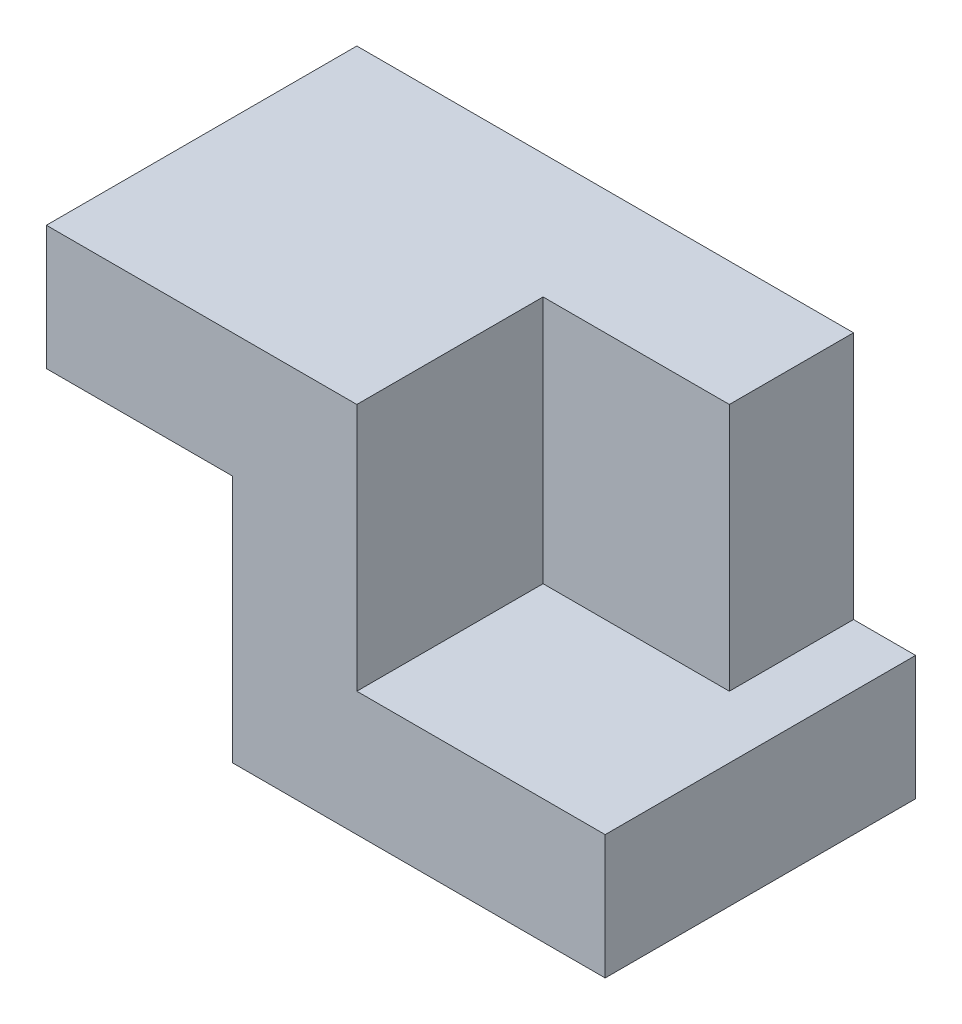
ISO-10303-21;
HEADER;
FILE_DESCRIPTION(('STEP AP214'),'2;1');
FILE_NAME('part.step','',(''),(''),'','','');
FILE_SCHEMA(('AUTOMOTIVE_DESIGN { 1 0 10303 214 1 1 1 1 }'));
ENDSEC;
DATA;
#1=APPLICATION_CONTEXT('core data for automotive mechanical design processes');
#2=APPLICATION_PROTOCOL_DEFINITION('international standard','automotive_design',2000,#1);
#3=PRODUCT_CONTEXT('',#1,'mechanical');
#4=PRODUCT('Part','Part','',(#3));
#5=PRODUCT_RELATED_PRODUCT_CATEGORY('part','',(#4));
#6=PRODUCT_DEFINITION_FORMATION('','',#4);
#7=PRODUCT_DEFINITION_CONTEXT('part definition',#1,'design');
#8=PRODUCT_DEFINITION('design','',#6,#7);
#9=PRODUCT_DEFINITION_SHAPE('','',#8);
#10=(LENGTH_UNIT() NAMED_UNIT(*) SI_UNIT(.MILLI.,.METRE.));
#11=(NAMED_UNIT(*) PLANE_ANGLE_UNIT() SI_UNIT($,.RADIAN.));
#12=(NAMED_UNIT(*) SI_UNIT($,.STERADIAN.) SOLID_ANGLE_UNIT());
#13=UNCERTAINTY_MEASURE_WITH_UNIT(LENGTH_MEASURE(1.E-05),#10,'distance_accuracy_value','');
#14=(GEOMETRIC_REPRESENTATION_CONTEXT(3) GLOBAL_UNCERTAINTY_ASSIGNED_CONTEXT((#13)) GLOBAL_UNIT_ASSIGNED_CONTEXT((#10,
#11,#12)) REPRESENTATION_CONTEXT('',''));
#15=CARTESIAN_POINT('',(0.,0.,0.));
#16=DIRECTION('',(0.,0.,1.));
#17=DIRECTION('',(1.,0.,0.));
#18=AXIS2_PLACEMENT_3D('',#15,#16,#17);
#19=CARTESIAN_POINT('',(45.,-30.,50.));
#20=DIRECTION('',(-1.,0.,0.));
#21=DIRECTION('',(0.,0.,1.));
#22=AXIS2_PLACEMENT_3D('',#19,#20,#21);
#23=PLANE('',#22);
#24=DIRECTION('',(0.,0.,-1.));
#25=VECTOR('',#24,1.);
#26=CARTESIAN_POINT('',(45.,-10.,0.));
#27=LINE('',#26,#25);
#28=CARTESIAN_POINT('',(45.,-10.,50.));
#29=VERTEX_POINT('',#28);
#30=CARTESIAN_POINT('',(45.,-10.,0.));
#31=VERTEX_POINT('',#30);
#32=EDGE_CURVE('E54',#29,#31,#27,.T.);
#33=ORIENTED_EDGE('',*,*,#32,.F.);
#34=DIRECTION('',(0.,1.,0.));
#35=VECTOR('',#34,1.);
#36=CARTESIAN_POINT('',(45.,-30.,50.));
#37=LINE('',#36,#35);
#38=CARTESIAN_POINT('',(45.,-30.,50.));
#39=VERTEX_POINT('',#38);
#40=EDGE_CURVE('E141',#39,#29,#37,.T.);
#41=ORIENTED_EDGE('',*,*,#40,.F.);
#42=DIRECTION('',(0.,0.,-1.));
#43=VECTOR('',#42,1.);
#44=CARTESIAN_POINT('',(45.,-30.,50.));
#45=LINE('',#44,#43);
#46=CARTESIAN_POINT('',(45.,-30.,0.));
#47=VERTEX_POINT('',#46);
#48=EDGE_CURVE('E47',#39,#47,#45,.T.);
#49=ORIENTED_EDGE('',*,*,#48,.T.);
#50=DIRECTION('',(0.,1.,0.));
#51=VECTOR('',#50,1.);
#52=CARTESIAN_POINT('',(45.,-30.,0.));
#53=LINE('',#52,#51);
#54=EDGE_CURVE('E191',#47,#31,#53,.T.);
#55=ORIENTED_EDGE('',*,*,#54,.T.);
#56=EDGE_LOOP('',(#33,#41,#49,#55));
#57=FACE_BOUND('',#56,.T.);
#58=ADVANCED_FACE('F39',(#57),#23,.F.);
#59=CARTESIAN_POINT('',(-45.,30.,50.));
#60=DIRECTION('',(0.,-1.,0.));
#61=DIRECTION('',(0.,0.,-1.));
#62=AXIS2_PLACEMENT_3D('',#59,#60,#61);
#63=PLANE('',#62);
#64=DIRECTION('',(0.,0.,-1.));
#65=VECTOR('',#64,1.);
#66=CARTESIAN_POINT('',(5.00000000000001,30.,0.));
#67=LINE('',#66,#65);
#68=CARTESIAN_POINT('',(5.00000000000001,30.,50.));
#69=VERTEX_POINT('',#68);
#70=CARTESIAN_POINT('',(5.00000000000001,30.,20.));
#71=VERTEX_POINT('',#70);
#72=EDGE_CURVE('E122',#69,#71,#67,.T.);
#73=ORIENTED_EDGE('',*,*,#72,.T.);
#74=DIRECTION('',(-1.,0.,0.));
#75=VECTOR('',#74,1.);
#76=CARTESIAN_POINT('',(0.,30.,20.));
#77=LINE('',#76,#75);
#78=CARTESIAN_POINT('',(35.,30.,20.));
#79=VERTEX_POINT('',#78);
#80=EDGE_CURVE('E136',#79,#71,#77,.T.);
#81=ORIENTED_EDGE('',*,*,#80,.F.);
#82=DIRECTION('',(0.,0.,1.));
#83=VECTOR('',#82,1.);
#84=CARTESIAN_POINT('',(35.,30.,0.));
#85=LINE('',#84,#83);
#86=CARTESIAN_POINT('',(35.,30.,0.));
#87=VERTEX_POINT('',#86);
#88=EDGE_CURVE('E157',#87,#79,#85,.T.);
#89=ORIENTED_EDGE('',*,*,#88,.F.);
#90=DIRECTION('',(-1.,0.,0.));
#91=VECTOR('',#90,1.);
#92=CARTESIAN_POINT('',(-45.,30.,0.));
#93=LINE('',#92,#91);
#94=CARTESIAN_POINT('',(-45.,30.,0.));
#95=VERTEX_POINT('',#94);
#96=EDGE_CURVE('E210',#87,#95,#93,.T.);
#97=ORIENTED_EDGE('',*,*,#96,.T.);
#98=DIRECTION('',(0.,0.,-1.));
#99=VECTOR('',#98,1.);
#100=CARTESIAN_POINT('',(-45.,30.,50.));
#101=LINE('',#100,#99);
#102=CARTESIAN_POINT('',(-45.,30.,50.));
#103=VERTEX_POINT('',#102);
#104=EDGE_CURVE('E11',#103,#95,#101,.T.);
#105=ORIENTED_EDGE('',*,*,#104,.F.);
#106=DIRECTION('',(-1.,0.,0.));
#107=VECTOR('',#106,1.);
#108=CARTESIAN_POINT('',(-45.,30.,50.));
#109=LINE('',#108,#107);
#110=EDGE_CURVE('E196',#69,#103,#109,.T.);
#111=ORIENTED_EDGE('',*,*,#110,.F.);
#112=EDGE_LOOP('',(#73,#81,#89,#97,#105,#111));
#113=FACE_BOUND('',#112,.T.);
#114=ADVANCED_FACE('F237',(#113),#63,.F.);
#115=CARTESIAN_POINT('',(0.,0.,50.));
#116=DIRECTION('',(0.,0.,-1.));
#117=DIRECTION('',(-1.,0.,0.));
#118=AXIS2_PLACEMENT_3D('',#115,#116,#117);
#119=PLANE('',#118);
#120=DIRECTION('',(0.,1.,0.));
#121=VECTOR('',#120,1.);
#122=CARTESIAN_POINT('',(5.00000000000001,-10.,50.));
#123=LINE('',#122,#121);
#124=CARTESIAN_POINT('',(5.00000000000001,-10.,50.));
#125=VERTEX_POINT('',#124);
#126=EDGE_CURVE('E116',#125,#69,#123,.T.);
#127=ORIENTED_EDGE('',*,*,#126,.T.);
#128=ORIENTED_EDGE('',*,*,#110,.T.);
#129=DIRECTION('',(0.,-1.,0.));
#130=VECTOR('',#129,1.);
#131=CARTESIAN_POINT('',(-45.,-30.,50.));
#132=LINE('',#131,#130);
#133=CARTESIAN_POINT('',(-45.,10.,50.));
#134=VERTEX_POINT('',#133);
#135=EDGE_CURVE('E200',#103,#134,#132,.T.);
#136=ORIENTED_EDGE('',*,*,#135,.T.);
#137=DIRECTION('',(-1.,0.,0.));
#138=VECTOR('',#137,1.);
#139=CARTESIAN_POINT('',(-15.,10.,50.));
#140=LINE('',#139,#138);
#141=CARTESIAN_POINT('',(-15.,10.,50.));
#142=VERTEX_POINT('',#141);
#143=EDGE_CURVE('E184',#142,#134,#140,.T.);
#144=ORIENTED_EDGE('',*,*,#143,.F.);
#145=DIRECTION('',(0.,1.,0.));
#146=VECTOR('',#145,1.);
#147=CARTESIAN_POINT('',(-15.,-30.,50.));
#148=LINE('',#147,#146);
#149=CARTESIAN_POINT('',(-15.,-30.,50.));
#150=VERTEX_POINT('',#149);
#151=EDGE_CURVE('E179',#150,#142,#148,.T.);
#152=ORIENTED_EDGE('',*,*,#151,.F.);
#153=DIRECTION('',(1.,0.,0.));
#154=VECTOR('',#153,1.);
#155=CARTESIAN_POINT('',(-45.,-30.,50.));
#156=LINE('',#155,#154);
#157=EDGE_CURVE('E204',#150,#39,#156,.T.);
#158=ORIENTED_EDGE('',*,*,#157,.T.);
#159=ORIENTED_EDGE('',*,*,#40,.T.);
#160=DIRECTION('',(1.,0.,0.));
#161=VECTOR('',#160,1.);
#162=CARTESIAN_POINT('',(0.,-10.,50.));
#163=LINE('',#162,#161);
#164=EDGE_CURVE('E132',#125,#29,#163,.T.);
#165=ORIENTED_EDGE('',*,*,#164,.F.);
#166=EDGE_LOOP('',(#127,#128,#136,#144,#152,#158,#159,#165));
#167=FACE_BOUND('',#166,.T.);
#168=ADVANCED_FACE('F139',(#167),#119,.F.);
#169=CARTESIAN_POINT('',(-45.,-30.,50.));
#170=DIRECTION('',(1.,0.,0.));
#171=DIRECTION('',(0.,0.,-1.));
#172=AXIS2_PLACEMENT_3D('',#169,#170,#171);
#173=PLANE('',#172);
#174=DIRECTION('',(0.,-1.,0.));
#175=VECTOR('',#174,1.);
#176=CARTESIAN_POINT('',(-45.,-30.,0.));
#177=LINE('',#176,#175);
#178=CARTESIAN_POINT('',(-45.,10.,0.));
#179=VERTEX_POINT('',#178);
#180=EDGE_CURVE('E213',#95,#179,#177,.T.);
#181=ORIENTED_EDGE('',*,*,#180,.T.);
#182=DIRECTION('',(0.,0.,-1.));
#183=VECTOR('',#182,1.);
#184=CARTESIAN_POINT('',(-45.,10.,0.));
#185=LINE('',#184,#183);
#186=EDGE_CURVE('E167',#134,#179,#185,.T.);
#187=ORIENTED_EDGE('',*,*,#186,.F.);
#188=ORIENTED_EDGE('',*,*,#135,.F.);
#189=ORIENTED_EDGE('',*,*,#104,.T.);
#190=EDGE_LOOP('',(#181,#187,#188,#189));
#191=FACE_BOUND('',#190,.T.);
#192=ADVANCED_FACE('F244',(#191),#173,.F.);
#193=CARTESIAN_POINT('',(-45.,-30.,50.));
#194=DIRECTION('',(0.,1.,0.));
#195=DIRECTION('',(0.,0.,1.));
#196=AXIS2_PLACEMENT_3D('',#193,#194,#195);
#197=PLANE('',#196);
#198=ORIENTED_EDGE('',*,*,#157,.F.);
#199=DIRECTION('',(0.,0.,1.));
#200=VECTOR('',#199,1.);
#201=CARTESIAN_POINT('',(-15.,-30.,0.));
#202=LINE('',#201,#200);
#203=CARTESIAN_POINT('',(-15.,-30.,0.));
#204=VERTEX_POINT('',#203);
#205=EDGE_CURVE('E176',#204,#150,#202,.T.);
#206=ORIENTED_EDGE('',*,*,#205,.F.);
#207=DIRECTION('',(1.,0.,0.));
#208=VECTOR('',#207,1.);
#209=CARTESIAN_POINT('',(-45.,-30.,0.));
#210=LINE('',#209,#208);
#211=EDGE_CURVE('E197',#204,#47,#210,.T.);
#212=ORIENTED_EDGE('',*,*,#211,.T.);
#213=ORIENTED_EDGE('',*,*,#48,.F.);
#214=EDGE_LOOP('',(#198,#206,#212,#213));
#215=FACE_BOUND('',#214,.T.);
#216=ADVANCED_FACE('F250',(#215),#197,.F.);
#217=CARTESIAN_POINT('',(0.,0.,0.));
#218=DIRECTION('',(0.,0.,-1.));
#219=DIRECTION('',(-1.,0.,0.));
#220=AXIS2_PLACEMENT_3D('',#217,#218,#219);
#221=PLANE('',#220);
#222=DIRECTION('',(0.,1.,0.));
#223=VECTOR('',#222,1.);
#224=CARTESIAN_POINT('',(35.,-10.,0.));
#225=LINE('',#224,#223);
#226=CARTESIAN_POINT('',(35.,-10.,0.));
#227=VERTEX_POINT('',#226);
#228=EDGE_CURVE('E127',#227,#87,#225,.T.);
#229=ORIENTED_EDGE('',*,*,#228,.F.);
#230=DIRECTION('',(-1.,0.,0.));
#231=VECTOR('',#230,1.);
#232=CARTESIAN_POINT('',(0.,-10.,0.));
#233=LINE('',#232,#231);
#234=EDGE_CURVE('E145',#31,#227,#233,.T.);
#235=ORIENTED_EDGE('',*,*,#234,.F.);
#236=ORIENTED_EDGE('',*,*,#54,.F.);
#237=ORIENTED_EDGE('',*,*,#211,.F.);
#238=DIRECTION('',(0.,-1.,0.));
#239=VECTOR('',#238,1.);
#240=CARTESIAN_POINT('',(-15.,-30.,0.));
#241=LINE('',#240,#239);
#242=CARTESIAN_POINT('',(-15.,10.,0.));
#243=VERTEX_POINT('',#242);
#244=EDGE_CURVE('E173',#243,#204,#241,.T.);
#245=ORIENTED_EDGE('',*,*,#244,.F.);
#246=DIRECTION('',(-1.,0.,0.));
#247=VECTOR('',#246,1.);
#248=CARTESIAN_POINT('',(-15.,10.,0.));
#249=LINE('',#248,#247);
#250=EDGE_CURVE('E187',#243,#179,#249,.T.);
#251=ORIENTED_EDGE('',*,*,#250,.T.);
#252=ORIENTED_EDGE('',*,*,#180,.F.);
#253=ORIENTED_EDGE('',*,*,#96,.F.);
#254=EDGE_LOOP('',(#229,#235,#236,#237,#245,#251,#252,#253));
#255=FACE_BOUND('',#254,.T.);
#256=ADVANCED_FACE('F228',(#255),#221,.T.);
#257=CARTESIAN_POINT('',(-15.,10.,0.));
#258=DIRECTION('',(0.,1.,0.));
#259=DIRECTION('',(0.,0.,1.));
#260=AXIS2_PLACEMENT_3D('',#257,#258,#259);
#261=PLANE('',#260);
#262=ORIENTED_EDGE('',*,*,#186,.T.);
#263=ORIENTED_EDGE('',*,*,#250,.F.);
#264=DIRECTION('',(0.,0.,-1.));
#265=VECTOR('',#264,1.);
#266=CARTESIAN_POINT('',(-15.,10.,0.));
#267=LINE('',#266,#265);
#268=EDGE_CURVE('E62',#142,#243,#267,.T.);
#269=ORIENTED_EDGE('',*,*,#268,.F.);
#270=ORIENTED_EDGE('',*,*,#143,.T.);
#271=EDGE_LOOP('',(#262,#263,#269,#270));
#272=FACE_BOUND('',#271,.T.);
#273=ADVANCED_FACE('F247',(#272),#261,.F.);
#274=CARTESIAN_POINT('',(-15.,0.,0.));
#275=DIRECTION('',(1.,0.,0.));
#276=DIRECTION('',(0.,0.,-1.));
#277=AXIS2_PLACEMENT_3D('',#274,#275,#276);
#278=PLANE('',#277);
#279=ORIENTED_EDGE('',*,*,#244,.T.);
#280=ORIENTED_EDGE('',*,*,#205,.T.);
#281=ORIENTED_EDGE('',*,*,#151,.T.);
#282=ORIENTED_EDGE('',*,*,#268,.T.);
#283=EDGE_LOOP('',(#279,#280,#281,#282));
#284=FACE_BOUND('',#283,.T.);
#285=ADVANCED_FACE('F249',(#284),#278,.F.);
#286=CARTESIAN_POINT('',(5.00000000000001,-10.,0.));
#287=DIRECTION('',(1.,0.,0.));
#288=DIRECTION('',(0.,0.,-1.));
#289=AXIS2_PLACEMENT_3D('',#286,#287,#288);
#290=PLANE('',#289);
#291=ORIENTED_EDGE('',*,*,#72,.F.);
#292=ORIENTED_EDGE('',*,*,#126,.F.);
#293=DIRECTION('',(0.,0.,-1.));
#294=VECTOR('',#293,1.);
#295=CARTESIAN_POINT('',(5.00000000000001,-10.,0.));
#296=LINE('',#295,#294);
#297=CARTESIAN_POINT('',(5.00000000000001,-10.,20.));
#298=VERTEX_POINT('',#297);
#299=EDGE_CURVE('E119',#125,#298,#296,.T.);
#300=ORIENTED_EDGE('',*,*,#299,.T.);
#301=DIRECTION('',(0.,1.,0.));
#302=VECTOR('',#301,1.);
#303=CARTESIAN_POINT('',(5.00000000000001,-10.,20.));
#304=LINE('',#303,#302);
#305=EDGE_CURVE('E164',#298,#71,#304,.T.);
#306=ORIENTED_EDGE('',*,*,#305,.T.);
#307=EDGE_LOOP('',(#291,#292,#300,#306));
#308=FACE_BOUND('',#307,.T.);
#309=ADVANCED_FACE('F118',(#308),#290,.T.);
#310=CARTESIAN_POINT('',(0.,-10.,20.));
#311=DIRECTION('',(0.,0.,-1.));
#312=DIRECTION('',(-1.,0.,0.));
#313=AXIS2_PLACEMENT_3D('',#310,#311,#312);
#314=PLANE('',#313);
#315=ORIENTED_EDGE('',*,*,#80,.T.);
#316=ORIENTED_EDGE('',*,*,#305,.F.);
#317=DIRECTION('',(-1.,0.,0.));
#318=VECTOR('',#317,1.);
#319=CARTESIAN_POINT('',(0.,-10.,20.));
#320=LINE('',#319,#318);
#321=CARTESIAN_POINT('',(35.,-10.,20.));
#322=VERTEX_POINT('',#321);
#323=EDGE_CURVE('E128',#322,#298,#320,.T.);
#324=ORIENTED_EDGE('',*,*,#323,.F.);
#325=DIRECTION('',(0.,1.,0.));
#326=VECTOR('',#325,1.);
#327=CARTESIAN_POINT('',(35.,-10.,20.));
#328=LINE('',#327,#326);
#329=EDGE_CURVE('E168',#322,#79,#328,.T.);
#330=ORIENTED_EDGE('',*,*,#329,.T.);
#331=EDGE_LOOP('',(#315,#316,#324,#330));
#332=FACE_BOUND('',#331,.T.);
#333=ADVANCED_FACE('F233',(#332),#314,.F.);
#334=CARTESIAN_POINT('',(35.,-10.,0.));
#335=DIRECTION('',(-1.,0.,0.));
#336=DIRECTION('',(0.,0.,1.));
#337=AXIS2_PLACEMENT_3D('',#334,#335,#336);
#338=PLANE('',#337);
#339=ORIENTED_EDGE('',*,*,#88,.T.);
#340=ORIENTED_EDGE('',*,*,#329,.F.);
#341=DIRECTION('',(0.,0.,1.));
#342=VECTOR('',#341,1.);
#343=CARTESIAN_POINT('',(35.,-10.,0.));
#344=LINE('',#343,#342);
#345=EDGE_CURVE('E150',#227,#322,#344,.T.);
#346=ORIENTED_EDGE('',*,*,#345,.F.);
#347=ORIENTED_EDGE('',*,*,#228,.T.);
#348=EDGE_LOOP('',(#339,#340,#346,#347));
#349=FACE_BOUND('',#348,.T.);
#350=ADVANCED_FACE('F276',(#349),#338,.F.);
#351=CARTESIAN_POINT('',(0.,-10.,0.));
#352=DIRECTION('',(0.,1.,0.));
#353=DIRECTION('',(0.,0.,1.));
#354=AXIS2_PLACEMENT_3D('',#351,#352,#353);
#355=PLANE('',#354);
#356=ORIENTED_EDGE('',*,*,#299,.F.);
#357=ORIENTED_EDGE('',*,*,#164,.T.);
#358=ORIENTED_EDGE('',*,*,#32,.T.);
#359=ORIENTED_EDGE('',*,*,#234,.T.);
#360=ORIENTED_EDGE('',*,*,#345,.T.);
#361=ORIENTED_EDGE('',*,*,#323,.T.);
#362=EDGE_LOOP('',(#356,#357,#358,#359,#360,#361));
#363=FACE_BOUND('',#362,.T.);
#364=ADVANCED_FACE('F131',(#363),#355,.T.);
#365=CLOSED_SHELL('',(#58,#114,#168,#192,#216,#256,#273,#285,#309,#333,#350,#364));
#366=MANIFOLD_SOLID_BREP('B2',#365);
#367=ADVANCED_BREP_SHAPE_REPRESENTATION('',(#18,#366),#14);
#368=SHAPE_DEFINITION_REPRESENTATION(#9,#367);
ENDSEC;
END-ISO-10303-21;
